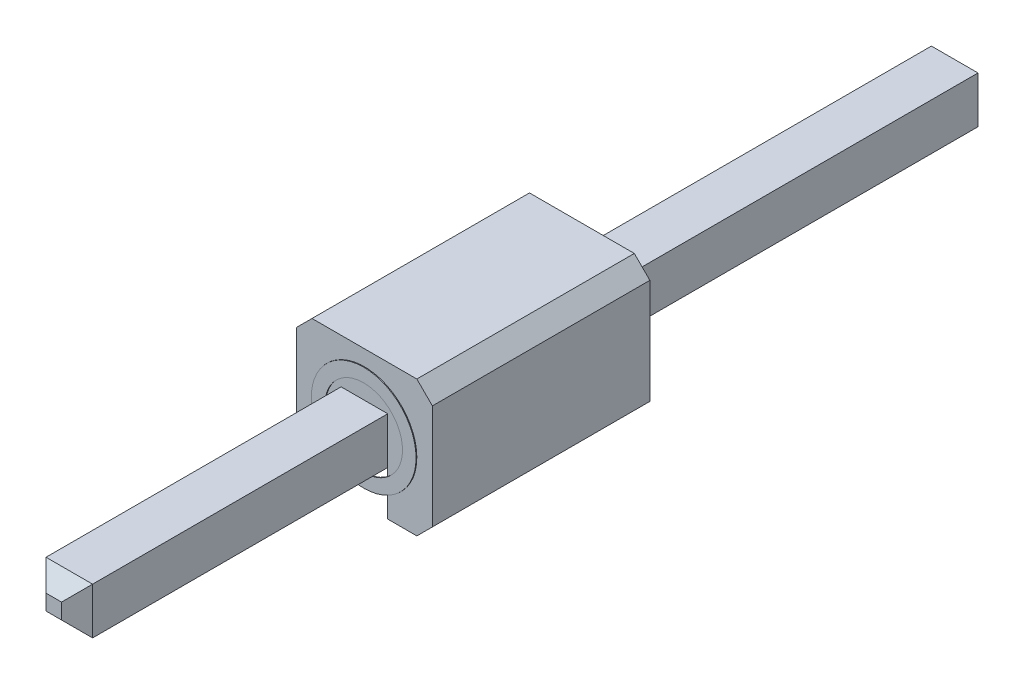
ISO-10303-21;
HEADER;
FILE_DESCRIPTION(('STEP AP214'),'2;1');
FILE_NAME('part.step','',(''),(''),'','','');
FILE_SCHEMA(('AUTOMOTIVE_DESIGN { 1 0 10303 214 1 1 1 1 }'));
ENDSEC;
DATA;
#1=APPLICATION_CONTEXT('core data for automotive mechanical design processes');
#2=APPLICATION_PROTOCOL_DEFINITION('international standard','automotive_design',2000,#1);
#3=PRODUCT_CONTEXT('',#1,'mechanical');
#4=PRODUCT('Part','Part','',(#3));
#5=PRODUCT_RELATED_PRODUCT_CATEGORY('part','',(#4));
#6=PRODUCT_DEFINITION_FORMATION('','',#4);
#7=PRODUCT_DEFINITION_CONTEXT('part definition',#1,'design');
#8=PRODUCT_DEFINITION('design','',#6,#7);
#9=PRODUCT_DEFINITION_SHAPE('','',#8);
#10=(LENGTH_UNIT() NAMED_UNIT(*) SI_UNIT(.MILLI.,.METRE.));
#11=(NAMED_UNIT(*) PLANE_ANGLE_UNIT() SI_UNIT($,.RADIAN.));
#12=(NAMED_UNIT(*) SI_UNIT($,.STERADIAN.) SOLID_ANGLE_UNIT());
#13=UNCERTAINTY_MEASURE_WITH_UNIT(LENGTH_MEASURE(1.E-05),#10,'distance_accuracy_value','');
#14=(GEOMETRIC_REPRESENTATION_CONTEXT(3) GLOBAL_UNCERTAINTY_ASSIGNED_CONTEXT((#13)) GLOBAL_UNIT_ASSIGNED_CONTEXT((#10,
#11,#12)) REPRESENTATION_CONTEXT('',''));
#15=CARTESIAN_POINT('',(0.,0.,0.));
#16=DIRECTION('',(0.,0.,1.));
#17=DIRECTION('',(1.,0.,0.));
#18=AXIS2_PLACEMENT_3D('',#15,#16,#17);
#19=CARTESIAN_POINT('',(0.,0.,2.8));
#20=DIRECTION('',(0.,0.,-1.));
#21=DIRECTION('',(-1.,0.,0.));
#22=AXIS2_PLACEMENT_3D('',#19,#20,#21);
#23=PLANE('',#22);
#24=DIRECTION('',(0.,1.,0.));
#25=VECTOR('',#24,1.);
#26=CARTESIAN_POINT('',(0.3,0.3,2.8));
#27=LINE('',#26,#25);
#28=CARTESIAN_POINT('',(0.3,-0.4,2.8));
#29=VERTEX_POINT('',#28);
#30=CARTESIAN_POINT('',(0.3,-0.3,2.8));
#31=VERTEX_POINT('',#30);
#32=EDGE_CURVE('E232',#29,#31,#27,.T.);
#33=ORIENTED_EDGE('',*,*,#32,.F.);
#34=CARTESIAN_POINT('',(0.,0.,2.8));
#35=DIRECTION('',(0.,0.,1.));
#36=DIRECTION('',(1.,0.,0.));
#37=AXIS2_PLACEMENT_3D('',#34,#35,#36);
#38=CIRCLE('',#37,0.5);
#39=CARTESIAN_POINT('',(-0.3,-0.4,2.8));
#40=VERTEX_POINT('',#39);
#41=EDGE_CURVE('E682',#29,#40,#38,.T.);
#42=ORIENTED_EDGE('',*,*,#41,.T.);
#43=DIRECTION('',(0.,-1.,0.));
#44=VECTOR('',#43,1.);
#45=CARTESIAN_POINT('',(-0.3,0.3,2.8));
#46=LINE('',#45,#44);
#47=CARTESIAN_POINT('',(-0.3,-0.3,2.8));
#48=VERTEX_POINT('',#47);
#49=EDGE_CURVE('E243',#48,#40,#46,.T.);
#50=ORIENTED_EDGE('',*,*,#49,.F.);
#51=CARTESIAN_POINT('',(-0.3,0.3,2.8));
#52=VERTEX_POINT('',#51);
#53=EDGE_CURVE('E240',#52,#48,#46,.T.);
#54=ORIENTED_EDGE('',*,*,#53,.F.);
#55=DIRECTION('',(-1.,0.,0.));
#56=VECTOR('',#55,1.);
#57=CARTESIAN_POINT('',(-0.3,0.3,2.8));
#58=LINE('',#57,#56);
#59=CARTESIAN_POINT('',(0.3,0.3,2.8));
#60=VERTEX_POINT('',#59);
#61=EDGE_CURVE('E231',#60,#52,#58,.T.);
#62=ORIENTED_EDGE('',*,*,#61,.F.);
#63=DIRECTION('',(0.,-1.,0.));
#64=VECTOR('',#63,1.);
#65=CARTESIAN_POINT('',(0.3,0.,2.8));
#66=LINE('',#65,#64);
#67=EDGE_CURVE('E726',#60,#31,#66,.T.);
#68=ORIENTED_EDGE('',*,*,#67,.T.);
#69=EDGE_LOOP('',(#33,#42,#50,#54,#62,#68));
#70=FACE_BOUND('',#69,.T.);
#71=ADVANCED_FACE('F34',(#70),#23,.F.);
#72=CARTESIAN_POINT('',(0.,0.,2.8));
#73=DIRECTION('',(0.,0.,1.));
#74=DIRECTION('',(1.,0.,0.));
#75=AXIS2_PLACEMENT_3D('',#72,#73,#74);
#76=CIRCLE('',#75,0.674645204944682);
#77=CARTESIAN_POINT('',(0.3,-0.604273243288872,2.8));
#78=VERTEX_POINT('',#77);
#79=CARTESIAN_POINT('',(-0.3,-0.604273243288872,2.8));
#80=VERTEX_POINT('',#79);
#81=EDGE_CURVE('E215',#78,#80,#76,.T.);
#82=ORIENTED_EDGE('',*,*,#81,.F.);
#83=CARTESIAN_POINT('',(0.3,-0.875,2.8));
#84=VERTEX_POINT('',#83);
#85=EDGE_CURVE('E220',#84,#78,#27,.T.);
#86=ORIENTED_EDGE('',*,*,#85,.F.);
#87=DIRECTION('',(1.,0.,0.));
#88=VECTOR('',#87,1.);
#89=CARTESIAN_POINT('',(0.675,-0.875,2.8));
#90=LINE('',#89,#88);
#91=CARTESIAN_POINT('',(0.675,-0.875,2.8));
#92=VERTEX_POINT('',#91);
#93=EDGE_CURVE('E265',#84,#92,#90,.T.);
#94=ORIENTED_EDGE('',*,*,#93,.T.);
#95=DIRECTION('',(0.707106781186547,0.707106781186547,0.));
#96=VECTOR('',#95,1.);
#97=CARTESIAN_POINT('',(0.875,-0.675,2.8));
#98=LINE('',#97,#96);
#99=CARTESIAN_POINT('',(0.875,-0.675,2.8));
#100=VERTEX_POINT('',#99);
#101=EDGE_CURVE('E268',#92,#100,#98,.T.);
#102=ORIENTED_EDGE('',*,*,#101,.T.);
#103=DIRECTION('',(0.,1.,0.));
#104=VECTOR('',#103,1.);
#105=CARTESIAN_POINT('',(0.875,-0.675,2.8));
#106=LINE('',#105,#104);
#107=CARTESIAN_POINT('',(0.875,0.675,2.8));
#108=VERTEX_POINT('',#107);
#109=EDGE_CURVE('E270',#100,#108,#106,.T.);
#110=ORIENTED_EDGE('',*,*,#109,.T.);
#111=DIRECTION('',(-0.707106781186547,0.707106781186547,0.));
#112=VECTOR('',#111,1.);
#113=CARTESIAN_POINT('',(0.875,0.675,2.8));
#114=LINE('',#113,#112);
#115=CARTESIAN_POINT('',(0.675,0.875,2.8));
#116=VERTEX_POINT('',#115);
#117=EDGE_CURVE('E272',#108,#116,#114,.T.);
#118=ORIENTED_EDGE('',*,*,#117,.T.);
#119=DIRECTION('',(-1.,0.,0.));
#120=VECTOR('',#119,1.);
#121=CARTESIAN_POINT('',(0.675,0.875,2.8));
#122=LINE('',#121,#120);
#123=CARTESIAN_POINT('',(-0.675,0.875,2.8));
#124=VERTEX_POINT('',#123);
#125=EDGE_CURVE('E255',#116,#124,#122,.T.);
#126=ORIENTED_EDGE('',*,*,#125,.T.);
#127=DIRECTION('',(-0.707106781186547,-0.707106781186547,0.));
#128=VECTOR('',#127,1.);
#129=CARTESIAN_POINT('',(-0.675,0.875,2.8));
#130=LINE('',#129,#128);
#131=CARTESIAN_POINT('',(-0.875,0.675,2.8));
#132=VERTEX_POINT('',#131);
#133=EDGE_CURVE('E258',#124,#132,#130,.T.);
#134=ORIENTED_EDGE('',*,*,#133,.T.);
#135=DIRECTION('',(0.,-1.,0.));
#136=VECTOR('',#135,1.);
#137=CARTESIAN_POINT('',(-0.875,-0.675,2.8));
#138=LINE('',#137,#136);
#139=CARTESIAN_POINT('',(-0.875,-0.675,2.8));
#140=VERTEX_POINT('',#139);
#141=EDGE_CURVE('E261',#132,#140,#138,.T.);
#142=ORIENTED_EDGE('',*,*,#141,.T.);
#143=DIRECTION('',(0.707106781186547,-0.707106781186547,0.));
#144=VECTOR('',#143,1.);
#145=CARTESIAN_POINT('',(-0.675,-0.875,2.8));
#146=LINE('',#145,#144);
#147=CARTESIAN_POINT('',(-0.675,-0.875,2.8));
#148=VERTEX_POINT('',#147);
#149=EDGE_CURVE('E263',#140,#148,#146,.T.);
#150=ORIENTED_EDGE('',*,*,#149,.T.);
#151=CARTESIAN_POINT('',(-0.3,-0.875,2.8));
#152=VERTEX_POINT('',#151);
#153=EDGE_CURVE('E266',#148,#152,#90,.T.);
#154=ORIENTED_EDGE('',*,*,#153,.T.);
#155=EDGE_CURVE('E223',#80,#152,#46,.T.);
#156=ORIENTED_EDGE('',*,*,#155,.F.);
#157=EDGE_LOOP('',(#82,#86,#94,#102,#110,#118,#126,#134,#142,#150,#154,#156));
#158=FACE_BOUND('',#157,.T.);
#159=ADVANCED_FACE('F219',(#158),#23,.F.);
#160=CARTESIAN_POINT('',(0.,0.,0.));
#161=DIRECTION('',(0.,0.,-1.));
#162=DIRECTION('',(-1.,0.,0.));
#163=AXIS2_PLACEMENT_3D('',#160,#161,#162);
#164=PLANE('',#163);
#165=DIRECTION('',(-1.,0.,0.));
#166=VECTOR('',#165,1.);
#167=CARTESIAN_POINT('',(0.675,0.875,0.));
#168=LINE('',#167,#166);
#169=CARTESIAN_POINT('',(0.675,0.875,0.));
#170=VERTEX_POINT('',#169);
#171=CARTESIAN_POINT('',(-0.675,0.875,0.));
#172=VERTEX_POINT('',#171);
#173=EDGE_CURVE('E242',#170,#172,#168,.T.);
#174=ORIENTED_EDGE('',*,*,#173,.F.);
#175=DIRECTION('',(-0.707106781186547,0.707106781186547,0.));
#176=VECTOR('',#175,1.);
#177=CARTESIAN_POINT('',(0.875,0.675,0.));
#178=LINE('',#177,#176);
#179=CARTESIAN_POINT('',(0.875,0.675,0.));
#180=VERTEX_POINT('',#179);
#181=EDGE_CURVE('E259',#180,#170,#178,.T.);
#182=ORIENTED_EDGE('',*,*,#181,.F.);
#183=DIRECTION('',(0.,1.,0.));
#184=VECTOR('',#183,1.);
#185=CARTESIAN_POINT('',(0.875,-0.675,0.));
#186=LINE('',#185,#184);
#187=CARTESIAN_POINT('',(0.875,-0.675,0.));
#188=VERTEX_POINT('',#187);
#189=EDGE_CURVE('E287',#188,#180,#186,.T.);
#190=ORIENTED_EDGE('',*,*,#189,.F.);
#191=DIRECTION('',(0.707106781186547,0.707106781186547,0.));
#192=VECTOR('',#191,1.);
#193=CARTESIAN_POINT('',(0.875,-0.675,0.));
#194=LINE('',#193,#192);
#195=CARTESIAN_POINT('',(0.675,-0.875,0.));
#196=VERTEX_POINT('',#195);
#197=EDGE_CURVE('E285',#196,#188,#194,.T.);
#198=ORIENTED_EDGE('',*,*,#197,.F.);
#199=DIRECTION('',(1.,0.,0.));
#200=VECTOR('',#199,1.);
#201=CARTESIAN_POINT('',(0.675,-0.875,0.));
#202=LINE('',#201,#200);
#203=CARTESIAN_POINT('',(-0.675,-0.875,0.));
#204=VERTEX_POINT('',#203);
#205=EDGE_CURVE('E283',#204,#196,#202,.T.);
#206=ORIENTED_EDGE('',*,*,#205,.F.);
#207=DIRECTION('',(0.707106781186547,-0.707106781186547,0.));
#208=VECTOR('',#207,1.);
#209=CARTESIAN_POINT('',(-0.675,-0.875,0.));
#210=LINE('',#209,#208);
#211=CARTESIAN_POINT('',(-0.875,-0.675,0.));
#212=VERTEX_POINT('',#211);
#213=EDGE_CURVE('E281',#212,#204,#210,.T.);
#214=ORIENTED_EDGE('',*,*,#213,.F.);
#215=DIRECTION('',(0.,-1.,0.));
#216=VECTOR('',#215,1.);
#217=CARTESIAN_POINT('',(-0.875,-0.675,0.));
#218=LINE('',#217,#216);
#219=CARTESIAN_POINT('',(-0.875,0.675,0.));
#220=VERTEX_POINT('',#219);
#221=EDGE_CURVE('E279',#220,#212,#218,.T.);
#222=ORIENTED_EDGE('',*,*,#221,.F.);
#223=DIRECTION('',(-0.707106781186547,-0.707106781186547,0.));
#224=VECTOR('',#223,1.);
#225=CARTESIAN_POINT('',(-0.675,0.875,0.));
#226=LINE('',#225,#224);
#227=EDGE_CURVE('E277',#172,#220,#226,.T.);
#228=ORIENTED_EDGE('',*,*,#227,.F.);
#229=EDGE_LOOP('',(#174,#182,#190,#198,#206,#214,#222,#228));
#230=FACE_BOUND('',#229,.T.);
#231=DIRECTION('',(1.,0.,0.));
#232=VECTOR('',#231,1.);
#233=CARTESIAN_POINT('',(-0.3,-0.3,0.));
#234=LINE('',#233,#232);
#235=CARTESIAN_POINT('',(-0.3,-0.3,0.));
#236=VERTEX_POINT('',#235);
#237=CARTESIAN_POINT('',(0.3,-0.3,0.));
#238=VERTEX_POINT('',#237);
#239=EDGE_CURVE('E235',#236,#238,#234,.T.);
#240=ORIENTED_EDGE('',*,*,#239,.T.);
#241=DIRECTION('',(0.,1.,0.));
#242=VECTOR('',#241,1.);
#243=CARTESIAN_POINT('',(0.3,0.3,0.));
#244=LINE('',#243,#242);
#245=CARTESIAN_POINT('',(0.3,0.3,0.));
#246=VERTEX_POINT('',#245);
#247=EDGE_CURVE('E244',#238,#246,#244,.T.);
#248=ORIENTED_EDGE('',*,*,#247,.T.);
#249=DIRECTION('',(-1.,0.,0.));
#250=VECTOR('',#249,1.);
#251=CARTESIAN_POINT('',(-0.3,0.3,0.));
#252=LINE('',#251,#250);
#253=CARTESIAN_POINT('',(-0.3,0.3,0.));
#254=VERTEX_POINT('',#253);
#255=EDGE_CURVE('E247',#246,#254,#252,.T.);
#256=ORIENTED_EDGE('',*,*,#255,.T.);
#257=DIRECTION('',(0.,-1.,0.));
#258=VECTOR('',#257,1.);
#259=CARTESIAN_POINT('',(-0.3,0.3,0.));
#260=LINE('',#259,#258);
#261=EDGE_CURVE('E250',#254,#236,#260,.T.);
#262=ORIENTED_EDGE('',*,*,#261,.T.);
#263=EDGE_LOOP('',(#240,#248,#256,#262));
#264=FACE_BOUND('',#263,.T.);
#265=ADVANCED_FACE('F418',(#230,#264),#164,.T.);
#266=CARTESIAN_POINT('',(0.675,0.875,2.8));
#267=DIRECTION('',(0.,-1.,0.));
#268=DIRECTION('',(1.,0.,0.));
#269=AXIS2_PLACEMENT_3D('',#266,#267,#268);
#270=PLANE('',#269);
#271=ORIENTED_EDGE('',*,*,#173,.T.);
#272=DIRECTION('',(0.,0.,-1.));
#273=VECTOR('',#272,1.);
#274=CARTESIAN_POINT('',(-0.675,0.875,2.8));
#275=LINE('',#274,#273);
#276=EDGE_CURVE('E310',#124,#172,#275,.T.);
#277=ORIENTED_EDGE('',*,*,#276,.F.);
#278=ORIENTED_EDGE('',*,*,#125,.F.);
#279=DIRECTION('',(0.,0.,-1.));
#280=VECTOR('',#279,1.);
#281=CARTESIAN_POINT('',(0.675,0.875,2.8));
#282=LINE('',#281,#280);
#283=EDGE_CURVE('E274',#116,#170,#282,.T.);
#284=ORIENTED_EDGE('',*,*,#283,.T.);
#285=EDGE_LOOP('',(#271,#277,#278,#284));
#286=FACE_BOUND('',#285,.T.);
#287=ADVANCED_FACE('F424',(#286),#270,.F.);
#288=CARTESIAN_POINT('',(-0.675,0.875,2.8));
#289=DIRECTION('',(0.707106781186548,-0.707106781186548,0.));
#290=DIRECTION('',(0.707106781186548,0.707106781186548,0.));
#291=AXIS2_PLACEMENT_3D('',#288,#289,#290);
#292=PLANE('',#291);
#293=ORIENTED_EDGE('',*,*,#227,.T.);
#294=DIRECTION('',(0.,0.,-1.));
#295=VECTOR('',#294,1.);
#296=CARTESIAN_POINT('',(-0.875,0.675,2.8));
#297=LINE('',#296,#295);
#298=EDGE_CURVE('E307',#132,#220,#297,.T.);
#299=ORIENTED_EDGE('',*,*,#298,.F.);
#300=ORIENTED_EDGE('',*,*,#133,.F.);
#301=ORIENTED_EDGE('',*,*,#276,.T.);
#302=EDGE_LOOP('',(#293,#299,#300,#301));
#303=FACE_BOUND('',#302,.T.);
#304=ADVANCED_FACE('F449',(#303),#292,.F.);
#305=CARTESIAN_POINT('',(-0.875,-0.675,2.8));
#306=DIRECTION('',(1.,0.,0.));
#307=DIRECTION('',(0.,0.,-1.));
#308=AXIS2_PLACEMENT_3D('',#305,#306,#307);
#309=PLANE('',#308);
#310=ORIENTED_EDGE('',*,*,#221,.T.);
#311=DIRECTION('',(0.,0.,-1.));
#312=VECTOR('',#311,1.);
#313=CARTESIAN_POINT('',(-0.875,-0.675,2.8));
#314=LINE('',#313,#312);
#315=EDGE_CURVE('E304',#140,#212,#314,.T.);
#316=ORIENTED_EDGE('',*,*,#315,.F.);
#317=ORIENTED_EDGE('',*,*,#141,.F.);
#318=ORIENTED_EDGE('',*,*,#298,.T.);
#319=EDGE_LOOP('',(#310,#316,#317,#318));
#320=FACE_BOUND('',#319,.T.);
#321=ADVANCED_FACE('F445',(#320),#309,.F.);
#322=CARTESIAN_POINT('',(-0.675,-0.875,2.8));
#323=DIRECTION('',(0.707106781186548,0.707106781186548,0.));
#324=DIRECTION('',(-0.707106781186548,0.707106781186548,0.));
#325=AXIS2_PLACEMENT_3D('',#322,#323,#324);
#326=PLANE('',#325);
#327=ORIENTED_EDGE('',*,*,#213,.T.);
#328=DIRECTION('',(0.,0.,-1.));
#329=VECTOR('',#328,1.);
#330=CARTESIAN_POINT('',(-0.675,-0.875,2.8));
#331=LINE('',#330,#329);
#332=EDGE_CURVE('E301',#148,#204,#331,.T.);
#333=ORIENTED_EDGE('',*,*,#332,.F.);
#334=ORIENTED_EDGE('',*,*,#149,.F.);
#335=ORIENTED_EDGE('',*,*,#315,.T.);
#336=EDGE_LOOP('',(#327,#333,#334,#335));
#337=FACE_BOUND('',#336,.T.);
#338=ADVANCED_FACE('F441',(#337),#326,.F.);
#339=CARTESIAN_POINT('',(0.675,-0.875,2.8));
#340=DIRECTION('',(0.,1.,0.));
#341=DIRECTION('',(-1.,0.,0.));
#342=AXIS2_PLACEMENT_3D('',#339,#340,#341);
#343=PLANE('',#342);
#344=DIRECTION('',(1.,0.,0.));
#345=VECTOR('',#344,1.);
#346=CARTESIAN_POINT('',(-0.3,-0.875,1.8));
#347=LINE('',#346,#345);
#348=CARTESIAN_POINT('',(-0.3,-0.875,1.8));
#349=VERTEX_POINT('',#348);
#350=CARTESIAN_POINT('',(0.3,-0.875,1.8));
#351=VERTEX_POINT('',#350);
#352=EDGE_CURVE('E696',#349,#351,#347,.T.);
#353=ORIENTED_EDGE('',*,*,#352,.F.);
#354=DIRECTION('',(0.,0.,1.));
#355=VECTOR('',#354,1.);
#356=CARTESIAN_POINT('',(-0.3,-0.875,1.8));
#357=LINE('',#356,#355);
#358=EDGE_CURVE('E237',#349,#152,#357,.T.);
#359=ORIENTED_EDGE('',*,*,#358,.T.);
#360=ORIENTED_EDGE('',*,*,#153,.F.);
#361=ORIENTED_EDGE('',*,*,#332,.T.);
#362=ORIENTED_EDGE('',*,*,#205,.T.);
#363=DIRECTION('',(0.,0.,-1.));
#364=VECTOR('',#363,1.);
#365=CARTESIAN_POINT('',(0.675,-0.875,2.8));
#366=LINE('',#365,#364);
#367=EDGE_CURVE('E298',#92,#196,#366,.T.);
#368=ORIENTED_EDGE('',*,*,#367,.F.);
#369=ORIENTED_EDGE('',*,*,#93,.F.);
#370=DIRECTION('',(0.,0.,1.));
#371=VECTOR('',#370,1.);
#372=CARTESIAN_POINT('',(0.3,-0.875,1.8));
#373=LINE('',#372,#371);
#374=EDGE_CURVE('E229',#351,#84,#373,.T.);
#375=ORIENTED_EDGE('',*,*,#374,.F.);
#376=EDGE_LOOP('',(#353,#359,#360,#361,#362,#368,#369,#375));
#377=FACE_BOUND('',#376,.T.);
#378=ADVANCED_FACE('F437',(#377),#343,.F.);
#379=CARTESIAN_POINT('',(0.875,-0.675,2.8));
#380=DIRECTION('',(-0.707106781186548,0.707106781186548,0.));
#381=DIRECTION('',(-0.707106781186548,-0.707106781186548,0.));
#382=AXIS2_PLACEMENT_3D('',#379,#380,#381);
#383=PLANE('',#382);
#384=ORIENTED_EDGE('',*,*,#197,.T.);
#385=DIRECTION('',(0.,0.,-1.));
#386=VECTOR('',#385,1.);
#387=CARTESIAN_POINT('',(0.875,-0.675,2.8));
#388=LINE('',#387,#386);
#389=EDGE_CURVE('E295',#100,#188,#388,.T.);
#390=ORIENTED_EDGE('',*,*,#389,.F.);
#391=ORIENTED_EDGE('',*,*,#101,.F.);
#392=ORIENTED_EDGE('',*,*,#367,.T.);
#393=EDGE_LOOP('',(#384,#390,#391,#392));
#394=FACE_BOUND('',#393,.T.);
#395=ADVANCED_FACE('F433',(#394),#383,.F.);
#396=CARTESIAN_POINT('',(0.875,-0.675,2.8));
#397=DIRECTION('',(-1.,0.,0.));
#398=DIRECTION('',(0.,0.,1.));
#399=AXIS2_PLACEMENT_3D('',#396,#397,#398);
#400=PLANE('',#399);
#401=ORIENTED_EDGE('',*,*,#189,.T.);
#402=DIRECTION('',(0.,0.,-1.));
#403=VECTOR('',#402,1.);
#404=CARTESIAN_POINT('',(0.875,0.675,2.8));
#405=LINE('',#404,#403);
#406=EDGE_CURVE('E292',#108,#180,#405,.T.);
#407=ORIENTED_EDGE('',*,*,#406,.F.);
#408=ORIENTED_EDGE('',*,*,#109,.F.);
#409=ORIENTED_EDGE('',*,*,#389,.T.);
#410=EDGE_LOOP('',(#401,#407,#408,#409));
#411=FACE_BOUND('',#410,.T.);
#412=ADVANCED_FACE('F429',(#411),#400,.F.);
#413=CARTESIAN_POINT('',(0.875,0.675,2.8));
#414=DIRECTION('',(-0.707106781186548,-0.707106781186548,0.));
#415=DIRECTION('',(0.707106781186548,-0.707106781186548,0.));
#416=AXIS2_PLACEMENT_3D('',#413,#414,#415);
#417=PLANE('',#416);
#418=ORIENTED_EDGE('',*,*,#181,.T.);
#419=ORIENTED_EDGE('',*,*,#283,.F.);
#420=ORIENTED_EDGE('',*,*,#117,.F.);
#421=ORIENTED_EDGE('',*,*,#406,.T.);
#422=EDGE_LOOP('',(#418,#419,#420,#421));
#423=FACE_BOUND('',#422,.T.);
#424=ADVANCED_FACE('F426',(#423),#417,.F.);
#425=CARTESIAN_POINT('',(0.3,0.3,2.8));
#426=DIRECTION('',(-1.,0.,0.));
#427=DIRECTION('',(0.,-1.,0.));
#428=AXIS2_PLACEMENT_3D('',#425,#426,#427);
#429=PLANE('',#428);
#430=DIRECTION('',(0.,0.,1.));
#431=VECTOR('',#430,1.);
#432=CARTESIAN_POINT('',(0.3,-0.3,-5.));
#433=LINE('',#432,#431);
#434=CARTESIAN_POINT('',(0.3,-0.3,1.8));
#435=VERTEX_POINT('',#434);
#436=EDGE_CURVE('E387',#435,#31,#433,.T.);
#437=ORIENTED_EDGE('',*,*,#436,.F.);
#438=DIRECTION('',(0.,1.,0.));
#439=VECTOR('',#438,1.);
#440=CARTESIAN_POINT('',(0.3,-0.3,1.8));
#441=LINE('',#440,#439);
#442=EDGE_CURVE('E720',#351,#435,#441,.T.);
#443=ORIENTED_EDGE('',*,*,#442,.F.);
#444=ORIENTED_EDGE('',*,*,#374,.T.);
#445=ORIENTED_EDGE('',*,*,#85,.T.);
#446=DIRECTION('',(0.,1.,0.));
#447=VECTOR('',#446,1.);
#448=CARTESIAN_POINT('',(0.3,0.3,2.8));
#449=LINE('',#448,#447);
#450=EDGE_CURVE('E202',#78,#29,#449,.T.);
#451=ORIENTED_EDGE('',*,*,#450,.T.);
#452=ORIENTED_EDGE('',*,*,#32,.T.);
#453=EDGE_LOOP('',(#437,#443,#444,#445,#451,#452));
#454=FACE_BOUND('',#453,.T.);
#455=ADVANCED_FACE('F227',(#454),#429,.T.);
#456=CARTESIAN_POINT('',(-0.3,0.3,2.8));
#457=DIRECTION('',(1.,0.,0.));
#458=DIRECTION('',(0.,1.,0.));
#459=AXIS2_PLACEMENT_3D('',#456,#457,#458);
#460=PLANE('',#459);
#461=DIRECTION('',(0.,0.,1.));
#462=VECTOR('',#461,1.);
#463=CARTESIAN_POINT('',(-0.3,-0.3,-5.));
#464=LINE('',#463,#462);
#465=CARTESIAN_POINT('',(-0.3,-0.3,1.8));
#466=VERTEX_POINT('',#465);
#467=EDGE_CURVE('E690',#466,#48,#464,.T.);
#468=ORIENTED_EDGE('',*,*,#467,.T.);
#469=ORIENTED_EDGE('',*,*,#49,.T.);
#470=EDGE_CURVE('E688',#40,#80,#46,.T.);
#471=ORIENTED_EDGE('',*,*,#470,.T.);
#472=ORIENTED_EDGE('',*,*,#155,.T.);
#473=ORIENTED_EDGE('',*,*,#358,.F.);
#474=DIRECTION('',(0.,-1.,0.));
#475=VECTOR('',#474,1.);
#476=CARTESIAN_POINT('',(-0.3,-0.3,1.8));
#477=LINE('',#476,#475);
#478=EDGE_CURVE('E724',#466,#349,#477,.T.);
#479=ORIENTED_EDGE('',*,*,#478,.F.);
#480=EDGE_LOOP('',(#468,#469,#471,#472,#473,#479));
#481=FACE_BOUND('',#480,.T.);
#482=ADVANCED_FACE('F407',(#481),#460,.T.);
#483=CARTESIAN_POINT('',(0.,0.,1.8));
#484=DIRECTION('',(0.,0.,1.));
#485=DIRECTION('',(1.,0.,0.));
#486=AXIS2_PLACEMENT_3D('',#483,#484,#485);
#487=PLANE('',#486);
#488=ORIENTED_EDGE('',*,*,#478,.T.);
#489=ORIENTED_EDGE('',*,*,#352,.T.);
#490=ORIENTED_EDGE('',*,*,#442,.T.);
#491=DIRECTION('',(-1.,0.,0.));
#492=VECTOR('',#491,1.);
#493=CARTESIAN_POINT('',(-0.3,-0.3,1.8));
#494=LINE('',#493,#492);
#495=EDGE_CURVE('E697',#435,#466,#494,.T.);
#496=ORIENTED_EDGE('',*,*,#495,.T.);
#497=EDGE_LOOP('',(#488,#489,#490,#496));
#498=FACE_BOUND('',#497,.T.);
#499=ADVANCED_FACE('F399',(#498),#487,.T.);
#500=CARTESIAN_POINT('',(0.,0.,6.8));
#501=DIRECTION('',(0.,0.,1.));
#502=DIRECTION('',(1.,0.,0.));
#503=AXIS2_PLACEMENT_3D('',#500,#501,#502);
#504=PLANE('',#503);
#505=DIRECTION('',(0.,-1.,0.));
#506=VECTOR('',#505,1.);
#507=CARTESIAN_POINT('',(-0.100000000000001,0.,6.8));
#508=LINE('',#507,#506);
#509=CARTESIAN_POINT('',(-0.100000000000001,0.100000000000001,6.8));
#510=VERTEX_POINT('',#509);
#511=CARTESIAN_POINT('',(-0.100000000000001,-0.100000000000001,6.8));
#512=VERTEX_POINT('',#511);
#513=EDGE_CURVE('E335',#510,#512,#508,.T.);
#514=ORIENTED_EDGE('',*,*,#513,.T.);
#515=DIRECTION('',(1.,0.,0.));
#516=VECTOR('',#515,1.);
#517=CARTESIAN_POINT('',(0.,-0.100000000000001,6.8));
#518=LINE('',#517,#516);
#519=CARTESIAN_POINT('',(0.100000000000001,-0.100000000000001,6.8));
#520=VERTEX_POINT('',#519);
#521=EDGE_CURVE('E337',#512,#520,#518,.T.);
#522=ORIENTED_EDGE('',*,*,#521,.T.);
#523=DIRECTION('',(0.,1.,0.));
#524=VECTOR('',#523,1.);
#525=CARTESIAN_POINT('',(0.100000000000001,0.,6.8));
#526=LINE('',#525,#524);
#527=CARTESIAN_POINT('',(0.100000000000001,0.100000000000001,6.8));
#528=VERTEX_POINT('',#527);
#529=EDGE_CURVE('E331',#520,#528,#526,.T.);
#530=ORIENTED_EDGE('',*,*,#529,.T.);
#531=DIRECTION('',(-1.,0.,0.));
#532=VECTOR('',#531,1.);
#533=CARTESIAN_POINT('',(0.,0.100000000000001,6.8));
#534=LINE('',#533,#532);
#535=EDGE_CURVE('E333',#528,#510,#534,.T.);
#536=ORIENTED_EDGE('',*,*,#535,.T.);
#537=EDGE_LOOP('',(#514,#522,#530,#536));
#538=FACE_BOUND('',#537,.T.);
#539=ADVANCED_FACE('F396',(#538),#504,.T.);
#540=CARTESIAN_POINT('',(0.3,0.3,-5.));
#541=DIRECTION('',(0.,1.,0.));
#542=DIRECTION('',(0.,0.,1.));
#543=AXIS2_PLACEMENT_3D('',#540,#541,#542);
#544=PLANE('',#543);
#545=DIRECTION('',(0.,0.,1.));
#546=VECTOR('',#545,1.);
#547=CARTESIAN_POINT('',(-0.3,0.3,-5.));
#548=LINE('',#547,#546);
#549=CARTESIAN_POINT('',(-0.3,0.3,6.6));
#550=VERTEX_POINT('',#549);
#551=EDGE_CURVE('E730',#52,#550,#548,.T.);
#552=ORIENTED_EDGE('',*,*,#551,.T.);
#553=DIRECTION('',(1.,0.,0.));
#554=VECTOR('',#553,1.);
#555=CARTESIAN_POINT('',(0.3,0.3,6.6));
#556=LINE('',#555,#554);
#557=CARTESIAN_POINT('',(0.3,0.3,6.6));
#558=VERTEX_POINT('',#557);
#559=EDGE_CURVE('E43',#550,#558,#556,.T.);
#560=ORIENTED_EDGE('',*,*,#559,.T.);
#561=DIRECTION('',(0.,0.,1.));
#562=VECTOR('',#561,1.);
#563=CARTESIAN_POINT('',(0.3,0.3,-5.));
#564=LINE('',#563,#562);
#565=EDGE_CURVE('E356',#60,#558,#564,.T.);
#566=ORIENTED_EDGE('',*,*,#565,.F.);
#567=ORIENTED_EDGE('',*,*,#61,.T.);
#568=EDGE_LOOP('',(#552,#560,#566,#567));
#569=FACE_BOUND('',#568,.T.);
#570=ADVANCED_FACE('F398',(#569),#544,.T.);
#571=CARTESIAN_POINT('',(0.3,-0.3,-5.));
#572=DIRECTION('',(0.,-1.,0.));
#573=DIRECTION('',(0.,0.,-1.));
#574=AXIS2_PLACEMENT_3D('',#571,#572,#573);
#575=PLANE('',#574);
#576=CARTESIAN_POINT('',(0.3,-0.3,6.6));
#577=VERTEX_POINT('',#576);
#578=EDGE_CURVE('E380',#31,#577,#433,.T.);
#579=ORIENTED_EDGE('',*,*,#578,.T.);
#580=DIRECTION('',(-1.,0.,0.));
#581=VECTOR('',#580,1.);
#582=CARTESIAN_POINT('',(0.3,-0.3,6.6));
#583=LINE('',#582,#581);
#584=CARTESIAN_POINT('',(-0.3,-0.3,6.6));
#585=VERTEX_POINT('',#584);
#586=EDGE_CURVE('E340',#577,#585,#583,.T.);
#587=ORIENTED_EDGE('',*,*,#586,.T.);
#588=EDGE_CURVE('E733',#48,#585,#464,.T.);
#589=ORIENTED_EDGE('',*,*,#588,.F.);
#590=ORIENTED_EDGE('',*,*,#467,.F.);
#591=ORIENTED_EDGE('',*,*,#495,.F.);
#592=ORIENTED_EDGE('',*,*,#436,.T.);
#593=EDGE_LOOP('',(#579,#587,#589,#590,#591,#592));
#594=FACE_BOUND('',#593,.T.);
#595=ADVANCED_FACE('F384',(#594),#575,.T.);
#596=CARTESIAN_POINT('',(-0.3,0.3,-5.));
#597=DIRECTION('',(-1.,0.,0.));
#598=DIRECTION('',(0.,-1.,0.));
#599=AXIS2_PLACEMENT_3D('',#596,#597,#598);
#600=PLANE('',#599);
#601=ORIENTED_EDGE('',*,*,#588,.T.);
#602=DIRECTION('',(0.,1.,0.));
#603=VECTOR('',#602,1.);
#604=CARTESIAN_POINT('',(-0.3,0.3,6.6));
#605=LINE('',#604,#603);
#606=EDGE_CURVE('E343',#585,#550,#605,.T.);
#607=ORIENTED_EDGE('',*,*,#606,.T.);
#608=ORIENTED_EDGE('',*,*,#551,.F.);
#609=ORIENTED_EDGE('',*,*,#53,.T.);
#610=EDGE_LOOP('',(#601,#607,#608,#609));
#611=FACE_BOUND('',#610,.T.);
#612=ADVANCED_FACE('F522',(#611),#600,.T.);
#613=CARTESIAN_POINT('',(0.3,-0.3,-5.));
#614=DIRECTION('',(1.,0.,0.));
#615=DIRECTION('',(0.,1.,0.));
#616=AXIS2_PLACEMENT_3D('',#613,#614,#615);
#617=PLANE('',#616);
#618=ORIENTED_EDGE('',*,*,#565,.T.);
#619=DIRECTION('',(0.,-1.,0.));
#620=VECTOR('',#619,1.);
#621=CARTESIAN_POINT('',(0.3,-0.3,6.6));
#622=LINE('',#621,#620);
#623=EDGE_CURVE('E11',#558,#577,#622,.T.);
#624=ORIENTED_EDGE('',*,*,#623,.T.);
#625=ORIENTED_EDGE('',*,*,#578,.F.);
#626=ORIENTED_EDGE('',*,*,#67,.F.);
#627=EDGE_LOOP('',(#618,#624,#625,#626));
#628=FACE_BOUND('',#627,.T.);
#629=ADVANCED_FACE('F379',(#628),#617,.T.);
#630=CARTESIAN_POINT('',(-0.3,-0.3,-4.8));
#631=VERTEX_POINT('',#630);
#632=EDGE_CURVE('E389',#631,#236,#464,.T.);
#633=ORIENTED_EDGE('',*,*,#632,.F.);
#634=DIRECTION('',(1.,0.,0.));
#635=VECTOR('',#634,1.);
#636=CARTESIAN_POINT('',(0.3,-0.3,-4.8));
#637=LINE('',#636,#635);
#638=CARTESIAN_POINT('',(0.3,-0.3,-4.8));
#639=VERTEX_POINT('',#638);
#640=EDGE_CURVE('E327',#631,#639,#637,.T.);
#641=ORIENTED_EDGE('',*,*,#640,.T.);
#642=EDGE_CURVE('E391',#639,#238,#433,.T.);
#643=ORIENTED_EDGE('',*,*,#642,.T.);
#644=ORIENTED_EDGE('',*,*,#239,.F.);
#645=EDGE_LOOP('',(#633,#641,#643,#644));
#646=FACE_BOUND('',#645,.T.);
#647=ADVANCED_FACE('F528',(#646),#575,.T.);
#648=ORIENTED_EDGE('',*,*,#642,.F.);
#649=DIRECTION('',(0.,1.,0.));
#650=VECTOR('',#649,1.);
#651=CARTESIAN_POINT('',(0.3,0.3,-4.8));
#652=LINE('',#651,#650);
#653=CARTESIAN_POINT('',(0.3,0.3,-4.8));
#654=VERTEX_POINT('',#653);
#655=EDGE_CURVE('E329',#639,#654,#652,.T.);
#656=ORIENTED_EDGE('',*,*,#655,.T.);
#657=EDGE_CURVE('E728',#654,#246,#564,.T.);
#658=ORIENTED_EDGE('',*,*,#657,.T.);
#659=ORIENTED_EDGE('',*,*,#247,.F.);
#660=EDGE_LOOP('',(#648,#656,#658,#659));
#661=FACE_BOUND('',#660,.T.);
#662=ADVANCED_FACE('F519',(#661),#617,.T.);
#663=CARTESIAN_POINT('',(-0.3,0.3,-4.8));
#664=VERTEX_POINT('',#663);
#665=EDGE_CURVE('E731',#664,#254,#548,.T.);
#666=ORIENTED_EDGE('',*,*,#665,.F.);
#667=DIRECTION('',(0.,-1.,0.));
#668=VECTOR('',#667,1.);
#669=CARTESIAN_POINT('',(-0.3,-0.3,-4.8));
#670=LINE('',#669,#668);
#671=EDGE_CURVE('E325',#664,#631,#670,.T.);
#672=ORIENTED_EDGE('',*,*,#671,.T.);
#673=ORIENTED_EDGE('',*,*,#632,.T.);
#674=ORIENTED_EDGE('',*,*,#261,.F.);
#675=EDGE_LOOP('',(#666,#672,#673,#674));
#676=FACE_BOUND('',#675,.T.);
#677=ADVANCED_FACE('F512',(#676),#600,.T.);
#678=ORIENTED_EDGE('',*,*,#657,.F.);
#679=DIRECTION('',(-1.,0.,0.));
#680=VECTOR('',#679,1.);
#681=CARTESIAN_POINT('',(-0.3,0.3,-4.8));
#682=LINE('',#681,#680);
#683=EDGE_CURVE('E313',#654,#664,#682,.T.);
#684=ORIENTED_EDGE('',*,*,#683,.T.);
#685=ORIENTED_EDGE('',*,*,#665,.T.);
#686=ORIENTED_EDGE('',*,*,#255,.F.);
#687=EDGE_LOOP('',(#678,#684,#685,#686));
#688=FACE_BOUND('',#687,.T.);
#689=ADVANCED_FACE('F406',(#688),#544,.T.);
#690=CARTESIAN_POINT('',(0.,0.,-5.));
#691=DIRECTION('',(0.,0.,1.));
#692=DIRECTION('',(1.,0.,0.));
#693=AXIS2_PLACEMENT_3D('',#690,#691,#692);
#694=PLANE('',#693);
#695=DIRECTION('',(0.,1.,0.));
#696=VECTOR('',#695,1.);
#697=CARTESIAN_POINT('',(-0.0999999999999978,0.3,-5.));
#698=LINE('',#697,#696);
#699=CARTESIAN_POINT('',(-0.0999999999999977,-0.0999999999999977,-5.));
#700=VERTEX_POINT('',#699);
#701=CARTESIAN_POINT('',(-0.0999999999999977,0.0999999999999978,-5.));
#702=VERTEX_POINT('',#701);
#703=EDGE_CURVE('E320',#700,#702,#698,.T.);
#704=ORIENTED_EDGE('',*,*,#703,.T.);
#705=DIRECTION('',(1.,0.,0.));
#706=VECTOR('',#705,1.);
#707=CARTESIAN_POINT('',(0.3,0.0999999999999978,-5.));
#708=LINE('',#707,#706);
#709=CARTESIAN_POINT('',(0.0999999999999977,0.0999999999999978,-5.));
#710=VERTEX_POINT('',#709);
#711=EDGE_CURVE('E322',#702,#710,#708,.T.);
#712=ORIENTED_EDGE('',*,*,#711,.T.);
#713=DIRECTION('',(0.,-1.,0.));
#714=VECTOR('',#713,1.);
#715=CARTESIAN_POINT('',(0.0999999999999978,-0.3,-5.));
#716=LINE('',#715,#714);
#717=CARTESIAN_POINT('',(0.0999999999999977,-0.0999999999999977,-5.));
#718=VERTEX_POINT('',#717);
#719=EDGE_CURVE('E316',#710,#718,#716,.T.);
#720=ORIENTED_EDGE('',*,*,#719,.T.);
#721=DIRECTION('',(-1.,0.,0.));
#722=VECTOR('',#721,1.);
#723=CARTESIAN_POINT('',(-0.3,-0.0999999999999977,-5.));
#724=LINE('',#723,#722);
#725=EDGE_CURVE('E318',#718,#700,#724,.T.);
#726=ORIENTED_EDGE('',*,*,#725,.T.);
#727=EDGE_LOOP('',(#704,#712,#720,#726));
#728=FACE_BOUND('',#727,.T.);
#729=ADVANCED_FACE('F472',(#728),#694,.F.);
#730=CARTESIAN_POINT('',(0.3,-0.3,-4.8));
#731=DIRECTION('',(0.,-0.707106781186544,-0.707106781186551));
#732=DIRECTION('',(-1.,0.,0.));
#733=AXIS2_PLACEMENT_3D('',#730,#731,#732);
#734=PLANE('',#733);
#735=DIRECTION('',(0.577350269189627,0.577350269189628,-0.577350269189623));
#736=VECTOR('',#735,1.);
#737=CARTESIAN_POINT('',(-0.0999999999999989,-0.0999999999999988,-5.));
#738=LINE('',#737,#736);
#739=EDGE_CURVE('E350',#700,#631,#738,.F.);
#740=ORIENTED_EDGE('',*,*,#739,.F.);
#741=ORIENTED_EDGE('',*,*,#725,.F.);
#742=DIRECTION('',(-0.577350269189628,0.577350269189627,-0.577350269189622));
#743=VECTOR('',#742,1.);
#744=CARTESIAN_POINT('',(0.3,-0.3,-4.8));
#745=LINE('',#744,#743);
#746=EDGE_CURVE('E353',#639,#718,#745,.T.);
#747=ORIENTED_EDGE('',*,*,#746,.F.);
#748=ORIENTED_EDGE('',*,*,#640,.F.);
#749=EDGE_LOOP('',(#740,#741,#747,#748));
#750=FACE_BOUND('',#749,.T.);
#751=ADVANCED_FACE('F468',(#750),#734,.T.);
#752=CARTESIAN_POINT('',(0.3,-0.3,-4.8));
#753=DIRECTION('',(0.707106781186544,0.,-0.707106781186551));
#754=DIRECTION('',(0.,-1.,0.));
#755=AXIS2_PLACEMENT_3D('',#752,#753,#754);
#756=PLANE('',#755);
#757=ORIENTED_EDGE('',*,*,#746,.T.);
#758=ORIENTED_EDGE('',*,*,#719,.F.);
#759=DIRECTION('',(0.577350269189627,0.577350269189628,0.577350269189623));
#760=VECTOR('',#759,1.);
#761=CARTESIAN_POINT('',(0.0999999999999988,0.099999999999999,-5.));
#762=LINE('',#761,#760);
#763=EDGE_CURVE('E348',#654,#710,#762,.F.);
#764=ORIENTED_EDGE('',*,*,#763,.F.);
#765=ORIENTED_EDGE('',*,*,#655,.F.);
#766=EDGE_LOOP('',(#757,#758,#764,#765));
#767=FACE_BOUND('',#766,.T.);
#768=ADVANCED_FACE('F464',(#767),#756,.T.);
#769=CARTESIAN_POINT('',(-0.3,0.3,-4.8));
#770=DIRECTION('',(-0.707106781186544,0.,-0.707106781186551));
#771=DIRECTION('',(0.,1.,0.));
#772=AXIS2_PLACEMENT_3D('',#769,#770,#771);
#773=PLANE('',#772);
#774=ORIENTED_EDGE('',*,*,#739,.T.);
#775=ORIENTED_EDGE('',*,*,#671,.F.);
#776=DIRECTION('',(0.577350269189628,-0.577350269189627,-0.577350269189622));
#777=VECTOR('',#776,1.);
#778=CARTESIAN_POINT('',(-0.3,0.3,-4.8));
#779=LINE('',#778,#777);
#780=EDGE_CURVE('E346',#702,#664,#779,.F.);
#781=ORIENTED_EDGE('',*,*,#780,.F.);
#782=ORIENTED_EDGE('',*,*,#703,.F.);
#783=EDGE_LOOP('',(#774,#775,#781,#782));
#784=FACE_BOUND('',#783,.T.);
#785=ADVANCED_FACE('F460',(#784),#773,.T.);
#786=CARTESIAN_POINT('',(0.3,0.3,-4.8));
#787=DIRECTION('',(0.,0.707106781186544,-0.707106781186551));
#788=DIRECTION('',(1.,0.,0.));
#789=AXIS2_PLACEMENT_3D('',#786,#787,#788);
#790=PLANE('',#789);
#791=ORIENTED_EDGE('',*,*,#763,.T.);
#792=ORIENTED_EDGE('',*,*,#711,.F.);
#793=ORIENTED_EDGE('',*,*,#780,.T.);
#794=ORIENTED_EDGE('',*,*,#683,.F.);
#795=EDGE_LOOP('',(#791,#792,#793,#794));
#796=FACE_BOUND('',#795,.T.);
#797=ADVANCED_FACE('F457',(#796),#790,.T.);
#798=CARTESIAN_POINT('',(0.,0.100000000000001,6.8));
#799=DIRECTION('',(0.,-0.707106781186548,-0.707106781186548));
#800=DIRECTION('',(-1.,0.,0.));
#801=AXIS2_PLACEMENT_3D('',#798,#799,#800);
#802=PLANE('',#801);
#803=DIRECTION('',(-0.577350269189626,-0.577350269189626,0.577350269189626));
#804=VECTOR('',#803,1.);
#805=CARTESIAN_POINT('',(0.0666666666666674,0.0666666666666675,6.83333333333333));
#806=LINE('',#805,#804);
#807=EDGE_CURVE('E359',#558,#528,#806,.T.);
#808=ORIENTED_EDGE('',*,*,#807,.F.);
#809=ORIENTED_EDGE('',*,*,#559,.F.);
#810=DIRECTION('',(0.577350269189626,-0.577350269189626,0.577350269189626));
#811=VECTOR('',#810,1.);
#812=CARTESIAN_POINT('',(-0.0666666666666675,0.0666666666666675,6.83333333333333));
#813=LINE('',#812,#811);
#814=EDGE_CURVE('E38',#510,#550,#813,.F.);
#815=ORIENTED_EDGE('',*,*,#814,.F.);
#816=ORIENTED_EDGE('',*,*,#535,.F.);
#817=EDGE_LOOP('',(#808,#809,#815,#816));
#818=FACE_BOUND('',#817,.T.);
#819=ADVANCED_FACE('F36',(#818),#802,.F.);
#820=CARTESIAN_POINT('',(-0.100000000000001,0.,6.8));
#821=DIRECTION('',(0.707106781186548,0.,-0.707106781186548));
#822=DIRECTION('',(0.,-1.,0.));
#823=AXIS2_PLACEMENT_3D('',#820,#821,#822);
#824=PLANE('',#823);
#825=ORIENTED_EDGE('',*,*,#814,.T.);
#826=ORIENTED_EDGE('',*,*,#606,.F.);
#827=DIRECTION('',(0.577350269189626,0.577350269189626,0.577350269189626));
#828=VECTOR('',#827,1.);
#829=CARTESIAN_POINT('',(-0.0666666666666675,-0.0666666666666674,6.83333333333333));
#830=LINE('',#829,#828);
#831=EDGE_CURVE('E358',#512,#585,#830,.F.);
#832=ORIENTED_EDGE('',*,*,#831,.F.);
#833=ORIENTED_EDGE('',*,*,#513,.F.);
#834=EDGE_LOOP('',(#825,#826,#832,#833));
#835=FACE_BOUND('',#834,.T.);
#836=ADVANCED_FACE('F370',(#835),#824,.F.);
#837=CARTESIAN_POINT('',(0.100000000000001,0.,6.8));
#838=DIRECTION('',(-0.707106781186548,0.,-0.707106781186548));
#839=DIRECTION('',(0.,1.,0.));
#840=AXIS2_PLACEMENT_3D('',#837,#838,#839);
#841=PLANE('',#840);
#842=ORIENTED_EDGE('',*,*,#807,.T.);
#843=ORIENTED_EDGE('',*,*,#529,.F.);
#844=DIRECTION('',(0.577350269189626,-0.577350269189626,-0.577350269189626));
#845=VECTOR('',#844,1.);
#846=CARTESIAN_POINT('',(0.0666666666666675,-0.0666666666666674,6.83333333333333));
#847=LINE('',#846,#845);
#848=EDGE_CURVE('E209',#577,#520,#847,.F.);
#849=ORIENTED_EDGE('',*,*,#848,.F.);
#850=ORIENTED_EDGE('',*,*,#623,.F.);
#851=EDGE_LOOP('',(#842,#843,#849,#850));
#852=FACE_BOUND('',#851,.T.);
#853=ADVANCED_FACE('F375',(#852),#841,.F.);
#854=CARTESIAN_POINT('',(0.,-0.100000000000001,6.8));
#855=DIRECTION('',(0.,0.707106781186548,-0.707106781186548));
#856=DIRECTION('',(1.,0.,0.));
#857=AXIS2_PLACEMENT_3D('',#854,#855,#856);
#858=PLANE('',#857);
#859=ORIENTED_EDGE('',*,*,#831,.T.);
#860=ORIENTED_EDGE('',*,*,#586,.F.);
#861=ORIENTED_EDGE('',*,*,#848,.T.);
#862=ORIENTED_EDGE('',*,*,#521,.F.);
#863=EDGE_LOOP('',(#859,#860,#861,#862));
#864=FACE_BOUND('',#863,.T.);
#865=ADVANCED_FACE('F393',(#864),#858,.F.);
#866=CARTESIAN_POINT('',(0.,0.,2.81));
#867=DIRECTION('',(0.,0.,1.));
#868=DIRECTION('',(1.,0.,0.));
#869=AXIS2_PLACEMENT_3D('',#866,#867,#868);
#870=PLANE('',#869);
#871=CARTESIAN_POINT('',(0.,0.,2.81));
#872=DIRECTION('',(0.,0.,1.));
#873=DIRECTION('',(1.,0.,0.));
#874=AXIS2_PLACEMENT_3D('',#871,#872,#873);
#875=CIRCLE('',#874,0.674645204944682);
#876=CARTESIAN_POINT('',(0.674645204944682,0.,2.81));
#877=VERTEX_POINT('',#876);
#878=EDGE_CURVE('E210',#877,#877,#875,.T.);
#879=ORIENTED_EDGE('',*,*,#878,.T.);
#880=EDGE_LOOP('',(#879));
#881=FACE_BOUND('',#880,.T.);
#882=CARTESIAN_POINT('',(0.,0.,2.81));
#883=DIRECTION('',(0.,0.,1.));
#884=DIRECTION('',(1.,0.,0.));
#885=AXIS2_PLACEMENT_3D('',#882,#883,#884);
#886=CIRCLE('',#885,0.5);
#887=CARTESIAN_POINT('',(0.5,0.,2.81));
#888=VERTEX_POINT('',#887);
#889=EDGE_CURVE('E225',#888,#888,#886,.T.);
#890=ORIENTED_EDGE('',*,*,#889,.F.);
#891=EDGE_LOOP('',(#890));
#892=FACE_BOUND('',#891,.T.);
#893=ADVANCED_FACE('F476',(#881,#892),#870,.T.);
#894=CARTESIAN_POINT('',(0.,0.,2.8));
#895=DIRECTION('',(0.,0.,1.));
#896=DIRECTION('',(1.,0.,0.));
#897=AXIS2_PLACEMENT_3D('',#894,#895,#896);
#898=PLANE('',#897);
#899=ORIENTED_EDGE('',*,*,#450,.F.);
#900=EDGE_CURVE('E51',#80,#78,#76,.T.);
#901=ORIENTED_EDGE('',*,*,#900,.F.);
#902=ORIENTED_EDGE('',*,*,#470,.F.);
#903=EDGE_CURVE('E205',#40,#29,#38,.T.);
#904=ORIENTED_EDGE('',*,*,#903,.T.);
#905=EDGE_LOOP('',(#899,#901,#902,#904));
#906=FACE_BOUND('',#905,.T.);
#907=ADVANCED_FACE('F203',(#906),#898,.F.);
#908=CARTESIAN_POINT('',(0.,0.,2.81));
#909=DIRECTION('',(0.,0.,-1.));
#910=DIRECTION('',(-1.,0.,0.));
#911=AXIS2_PLACEMENT_3D('',#908,#909,#910);
#912=CYLINDRICAL_SURFACE('',#911,0.674645204944682);
#913=ORIENTED_EDGE('',*,*,#878,.F.);
#914=EDGE_LOOP('',(#913));
#915=FACE_BOUND('',#914,.T.);
#916=ORIENTED_EDGE('',*,*,#900,.T.);
#917=ORIENTED_EDGE('',*,*,#81,.T.);
#918=EDGE_LOOP('',(#916,#917));
#919=FACE_BOUND('',#918,.T.);
#920=ADVANCED_FACE('F214',(#915,#919),#912,.T.);
#921=CARTESIAN_POINT('',(0.,0.,2.81));
#922=DIRECTION('',(0.,0.,-1.));
#923=DIRECTION('',(-1.,0.,0.));
#924=AXIS2_PLACEMENT_3D('',#921,#922,#923);
#925=CYLINDRICAL_SURFACE('',#924,0.5);
#926=ORIENTED_EDGE('',*,*,#889,.T.);
#927=EDGE_LOOP('',(#926));
#928=FACE_BOUND('',#927,.T.);
#929=ORIENTED_EDGE('',*,*,#903,.F.);
#930=ORIENTED_EDGE('',*,*,#41,.F.);
#931=EDGE_LOOP('',(#929,#930));
#932=FACE_BOUND('',#931,.T.);
#933=ADVANCED_FACE('F665',(#928,#932),#925,.F.);
#934=CLOSED_SHELL('',(#71,#159,#265,#287,#304,#321,#338,#378,#395,#412,#424,#455,#482,#499,#539,
#570,#595,#612,#629,#647,#662,#677,#689,#729,#751,#768,#785,#797,#819,#836,#853,#865,#893,#907,
#920,#933));
#935=MANIFOLD_SOLID_BREP('B2',#934);
#936=ADVANCED_BREP_SHAPE_REPRESENTATION('',(#18,#935),#14);
#937=SHAPE_DEFINITION_REPRESENTATION(#9,#936);
ENDSEC;
END-ISO-10303-21;
